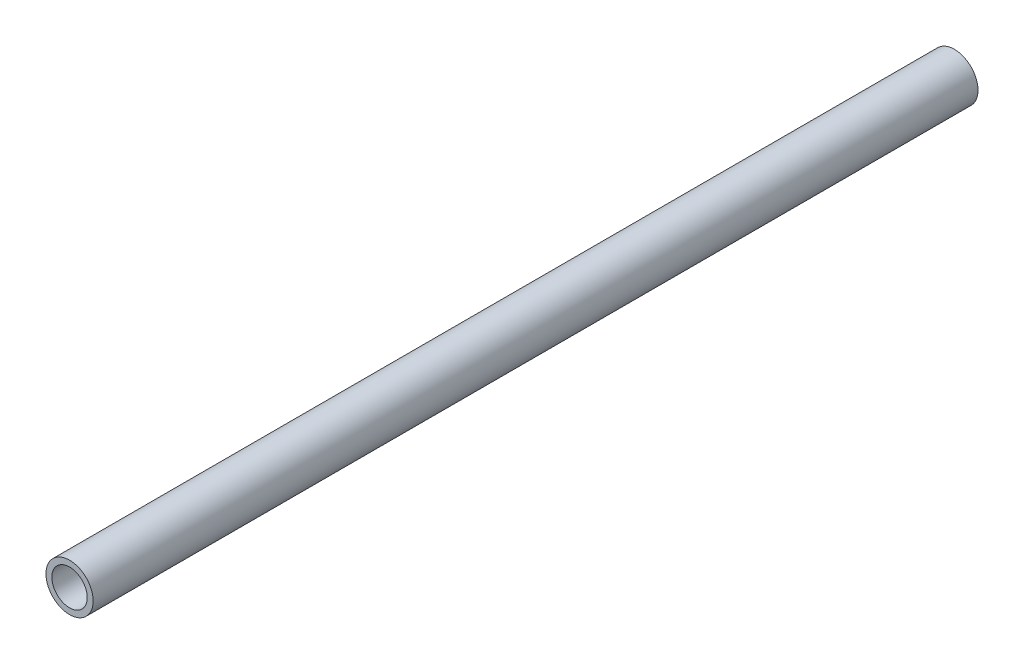
ISO-10303-21;
HEADER;
FILE_DESCRIPTION(('STEP AP214'),'2;1');
FILE_NAME('part.step','',(''),(''),'','','');
FILE_SCHEMA(('AUTOMOTIVE_DESIGN { 1 0 10303 214 1 1 1 1 }'));
ENDSEC;
DATA;
#1=APPLICATION_CONTEXT('core data for automotive mechanical design processes');
#2=APPLICATION_PROTOCOL_DEFINITION('international standard','automotive_design',2000,#1);
#3=PRODUCT_CONTEXT('',#1,'mechanical');
#4=PRODUCT('Part','Part','',(#3));
#5=PRODUCT_RELATED_PRODUCT_CATEGORY('part','',(#4));
#6=PRODUCT_DEFINITION_FORMATION('','',#4);
#7=PRODUCT_DEFINITION_CONTEXT('part definition',#1,'design');
#8=PRODUCT_DEFINITION('design','',#6,#7);
#9=PRODUCT_DEFINITION_SHAPE('','',#8);
#10=(LENGTH_UNIT() NAMED_UNIT(*) SI_UNIT(.MILLI.,.METRE.));
#11=(NAMED_UNIT(*) PLANE_ANGLE_UNIT() SI_UNIT($,.RADIAN.));
#12=(NAMED_UNIT(*) SI_UNIT($,.STERADIAN.) SOLID_ANGLE_UNIT());
#13=UNCERTAINTY_MEASURE_WITH_UNIT(LENGTH_MEASURE(1.E-05),#10,'distance_accuracy_value','');
#14=(GEOMETRIC_REPRESENTATION_CONTEXT(3) GLOBAL_UNCERTAINTY_ASSIGNED_CONTEXT((#13)) GLOBAL_UNIT_ASSIGNED_CONTEXT((#10,
#11,#12)) REPRESENTATION_CONTEXT('',''));
#15=CARTESIAN_POINT('',(0.,0.,0.));
#16=DIRECTION('',(0.,0.,1.));
#17=DIRECTION('',(1.,0.,0.));
#18=AXIS2_PLACEMENT_3D('',#15,#16,#17);
#19=CARTESIAN_POINT('',(0.,0.,750.));
#20=DIRECTION('',(0.,0.,1.));
#21=DIRECTION('',(1.,0.,0.));
#22=AXIS2_PLACEMENT_3D('',#19,#20,#21);
#23=PLANE('',#22);
#24=CARTESIAN_POINT('',(0.,0.,750.));
#25=DIRECTION('',(0.,0.,1.));
#26=DIRECTION('',(1.,0.,0.));
#27=AXIS2_PLACEMENT_3D('',#24,#25,#26);
#28=CIRCLE('',#27,20.);
#29=CARTESIAN_POINT('',(20.,0.,750.));
#30=VERTEX_POINT('',#29);
#31=EDGE_CURVE('E10',#30,#30,#28,.T.);
#32=ORIENTED_EDGE('',*,*,#31,.T.);
#33=EDGE_LOOP('',(#32));
#34=FACE_BOUND('',#33,.T.);
#35=CARTESIAN_POINT('',(0.,0.,750.));
#36=DIRECTION('',(0.,0.,1.));
#37=DIRECTION('',(1.,0.,0.));
#38=AXIS2_PLACEMENT_3D('',#35,#36,#37);
#39=CIRCLE('',#38,15.);
#40=CARTESIAN_POINT('',(15.,0.,750.));
#41=VERTEX_POINT('',#40);
#42=EDGE_CURVE('E48',#41,#41,#39,.T.);
#43=ORIENTED_EDGE('',*,*,#42,.F.);
#44=EDGE_LOOP('',(#43));
#45=FACE_BOUND('',#44,.T.);
#46=ADVANCED_FACE('F40',(#34,#45),#23,.T.);
#47=CARTESIAN_POINT('',(0.,0.,0.));
#48=DIRECTION('',(0.,0.,1.));
#49=DIRECTION('',(1.,0.,0.));
#50=AXIS2_PLACEMENT_3D('',#47,#48,#49);
#51=PLANE('',#50);
#52=CARTESIAN_POINT('',(0.,0.,0.));
#53=DIRECTION('',(0.,0.,1.));
#54=DIRECTION('',(1.,0.,0.));
#55=AXIS2_PLACEMENT_3D('',#52,#53,#54);
#56=CIRCLE('',#55,20.);
#57=CARTESIAN_POINT('',(20.,0.,0.));
#58=VERTEX_POINT('',#57);
#59=EDGE_CURVE('E41',#58,#58,#56,.T.);
#60=ORIENTED_EDGE('',*,*,#59,.F.);
#61=EDGE_LOOP('',(#60));
#62=FACE_BOUND('',#61,.T.);
#63=CARTESIAN_POINT('',(0.,0.,0.));
#64=DIRECTION('',(0.,0.,1.));
#65=DIRECTION('',(1.,0.,0.));
#66=AXIS2_PLACEMENT_3D('',#63,#64,#65);
#67=CIRCLE('',#66,15.);
#68=CARTESIAN_POINT('',(15.,0.,0.));
#69=VERTEX_POINT('',#68);
#70=EDGE_CURVE('E49',#69,#69,#67,.T.);
#71=ORIENTED_EDGE('',*,*,#70,.T.);
#72=EDGE_LOOP('',(#71));
#73=FACE_BOUND('',#72,.T.);
#74=ADVANCED_FACE('F58',(#62,#73),#51,.F.);
#75=CARTESIAN_POINT('',(0.,0.,750.));
#76=DIRECTION('',(0.,0.,-1.));
#77=DIRECTION('',(-1.,0.,0.));
#78=AXIS2_PLACEMENT_3D('',#75,#76,#77);
#79=CYLINDRICAL_SURFACE('',#78,20.);
#80=ORIENTED_EDGE('',*,*,#31,.F.);
#81=EDGE_LOOP('',(#80));
#82=FACE_BOUND('',#81,.T.);
#83=ORIENTED_EDGE('',*,*,#59,.T.);
#84=EDGE_LOOP('',(#83));
#85=FACE_BOUND('',#84,.T.);
#86=ADVANCED_FACE('F39',(#82,#85),#79,.T.);
#87=CARTESIAN_POINT('',(0.,0.,750.));
#88=DIRECTION('',(0.,0.,-1.));
#89=DIRECTION('',(-1.,0.,0.));
#90=AXIS2_PLACEMENT_3D('',#87,#88,#89);
#91=CYLINDRICAL_SURFACE('',#90,15.);
#92=ORIENTED_EDGE('',*,*,#42,.T.);
#93=EDGE_LOOP('',(#92));
#94=FACE_BOUND('',#93,.T.);
#95=ORIENTED_EDGE('',*,*,#70,.F.);
#96=EDGE_LOOP('',(#95));
#97=FACE_BOUND('',#96,.T.);
#98=ADVANCED_FACE('F57',(#94,#97),#91,.F.);
#99=CLOSED_SHELL('',(#46,#74,#86,#98));
#100=MANIFOLD_SOLID_BREP('B2',#99);
#101=ADVANCED_BREP_SHAPE_REPRESENTATION('',(#18,#100),#14);
#102=SHAPE_DEFINITION_REPRESENTATION(#9,#101);
ENDSEC;
END-ISO-10303-21;
